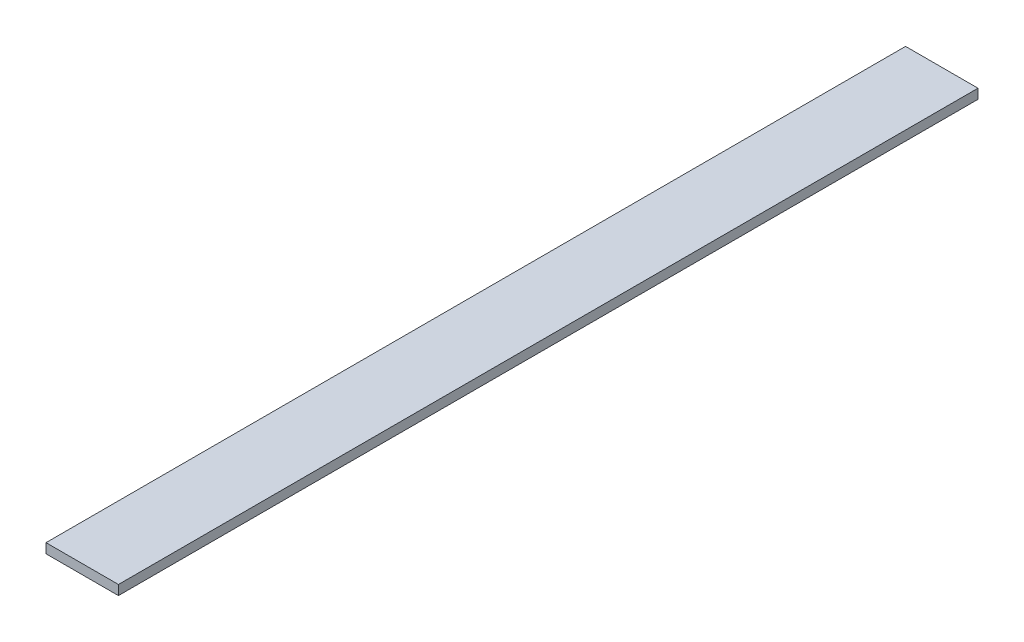
ISO-10303-21;
HEADER;
FILE_DESCRIPTION(('STEP AP214'),'2;1');
FILE_NAME('part.step','',(''),(''),'','','');
FILE_SCHEMA(('AUTOMOTIVE_DESIGN { 1 0 10303 214 1 1 1 1 }'));
ENDSEC;
DATA;
#1=APPLICATION_CONTEXT('core data for automotive mechanical design processes');
#2=APPLICATION_PROTOCOL_DEFINITION('international standard','automotive_design',2000,#1);
#3=PRODUCT_CONTEXT('',#1,'mechanical');
#4=PRODUCT('Part','Part','',(#3));
#5=PRODUCT_RELATED_PRODUCT_CATEGORY('part','',(#4));
#6=PRODUCT_DEFINITION_FORMATION('','',#4);
#7=PRODUCT_DEFINITION_CONTEXT('part definition',#1,'design');
#8=PRODUCT_DEFINITION('design','',#6,#7);
#9=PRODUCT_DEFINITION_SHAPE('','',#8);
#10=(LENGTH_UNIT() NAMED_UNIT(*) SI_UNIT(.MILLI.,.METRE.));
#11=(NAMED_UNIT(*) PLANE_ANGLE_UNIT() SI_UNIT($,.RADIAN.));
#12=(NAMED_UNIT(*) SI_UNIT($,.STERADIAN.) SOLID_ANGLE_UNIT());
#13=UNCERTAINTY_MEASURE_WITH_UNIT(LENGTH_MEASURE(1.E-05),#10,'distance_accuracy_value','');
#14=(GEOMETRIC_REPRESENTATION_CONTEXT(3) GLOBAL_UNCERTAINTY_ASSIGNED_CONTEXT((#13)) GLOBAL_UNIT_ASSIGNED_CONTEXT((#10,
#11,#12)) REPRESENTATION_CONTEXT('',''));
#15=CARTESIAN_POINT('',(0.,0.,0.));
#16=DIRECTION('',(0.,0.,1.));
#17=DIRECTION('',(1.,0.,0.));
#18=AXIS2_PLACEMENT_3D('',#15,#16,#17);
#19=CARTESIAN_POINT('',(7.5,1.,178.));
#20=DIRECTION('',(-1.,0.,0.));
#21=DIRECTION('',(0.,-1.,0.));
#22=AXIS2_PLACEMENT_3D('',#19,#20,#21);
#23=PLANE('',#22);
#24=DIRECTION('',(0.,1.,0.));
#25=VECTOR('',#24,1.);
#26=CARTESIAN_POINT('',(7.5,1.,0.));
#27=LINE('',#26,#25);
#28=CARTESIAN_POINT('',(7.5,-1.,0.));
#29=VERTEX_POINT('',#28);
#30=CARTESIAN_POINT('',(7.5,1.,0.));
#31=VERTEX_POINT('',#30);
#32=EDGE_CURVE('E111',#29,#31,#27,.T.);
#33=ORIENTED_EDGE('',*,*,#32,.T.);
#34=DIRECTION('',(0.,0.,-1.));
#35=VECTOR('',#34,1.);
#36=CARTESIAN_POINT('',(7.5,1.,178.));
#37=LINE('',#36,#35);
#38=CARTESIAN_POINT('',(7.5,1.,178.));
#39=VERTEX_POINT('',#38);
#40=EDGE_CURVE('E11',#39,#31,#37,.T.);
#41=ORIENTED_EDGE('',*,*,#40,.F.);
#42=DIRECTION('',(0.,1.,0.));
#43=VECTOR('',#42,1.);
#44=CARTESIAN_POINT('',(7.5,1.,178.));
#45=LINE('',#44,#43);
#46=CARTESIAN_POINT('',(7.5,-1.,178.));
#47=VERTEX_POINT('',#46);
#48=EDGE_CURVE('E95',#47,#39,#45,.T.);
#49=ORIENTED_EDGE('',*,*,#48,.F.);
#50=DIRECTION('',(0.,0.,-1.));
#51=VECTOR('',#50,1.);
#52=CARTESIAN_POINT('',(7.5,-1.,178.));
#53=LINE('',#52,#51);
#54=EDGE_CURVE('E107',#47,#29,#53,.T.);
#55=ORIENTED_EDGE('',*,*,#54,.T.);
#56=EDGE_LOOP('',(#33,#41,#49,#55));
#57=FACE_BOUND('',#56,.T.);
#58=ADVANCED_FACE('F43',(#57),#23,.F.);
#59=CARTESIAN_POINT('',(-7.5,1.,178.));
#60=DIRECTION('',(0.,-1.,0.));
#61=DIRECTION('',(0.,0.,-1.));
#62=AXIS2_PLACEMENT_3D('',#59,#60,#61);
#63=PLANE('',#62);
#64=DIRECTION('',(-1.,0.,0.));
#65=VECTOR('',#64,1.);
#66=CARTESIAN_POINT('',(-7.5,1.,0.));
#67=LINE('',#66,#65);
#68=CARTESIAN_POINT('',(-7.5,1.,0.));
#69=VERTEX_POINT('',#68);
#70=EDGE_CURVE('E100',#31,#69,#67,.T.);
#71=ORIENTED_EDGE('',*,*,#70,.T.);
#72=DIRECTION('',(0.,0.,-1.));
#73=VECTOR('',#72,1.);
#74=CARTESIAN_POINT('',(-7.5,1.,178.));
#75=LINE('',#74,#73);
#76=CARTESIAN_POINT('',(-7.5,1.,178.));
#77=VERTEX_POINT('',#76);
#78=EDGE_CURVE('E52',#77,#69,#75,.T.);
#79=ORIENTED_EDGE('',*,*,#78,.F.);
#80=DIRECTION('',(-1.,0.,0.));
#81=VECTOR('',#80,1.);
#82=CARTESIAN_POINT('',(-7.5,1.,178.));
#83=LINE('',#82,#81);
#84=EDGE_CURVE('E90',#39,#77,#83,.T.);
#85=ORIENTED_EDGE('',*,*,#84,.F.);
#86=ORIENTED_EDGE('',*,*,#40,.T.);
#87=EDGE_LOOP('',(#71,#79,#85,#86));
#88=FACE_BOUND('',#87,.T.);
#89=ADVANCED_FACE('F99',(#88),#63,.F.);
#90=CARTESIAN_POINT('',(-7.5,1.,178.));
#91=DIRECTION('',(1.,0.,0.));
#92=DIRECTION('',(0.,0.,-1.));
#93=AXIS2_PLACEMENT_3D('',#90,#91,#92);
#94=PLANE('',#93);
#95=DIRECTION('',(0.,-1.,0.));
#96=VECTOR('',#95,1.);
#97=CARTESIAN_POINT('',(-7.5,1.,0.));
#98=LINE('',#97,#96);
#99=CARTESIAN_POINT('',(-7.5,-1.,0.));
#100=VERTEX_POINT('',#99);
#101=EDGE_CURVE('E77',#69,#100,#98,.T.);
#102=ORIENTED_EDGE('',*,*,#101,.T.);
#103=DIRECTION('',(0.,0.,-1.));
#104=VECTOR('',#103,1.);
#105=CARTESIAN_POINT('',(-7.5,-1.,178.));
#106=LINE('',#105,#104);
#107=CARTESIAN_POINT('',(-7.5,-1.,178.));
#108=VERTEX_POINT('',#107);
#109=EDGE_CURVE('E102',#108,#100,#106,.T.);
#110=ORIENTED_EDGE('',*,*,#109,.F.);
#111=DIRECTION('',(0.,-1.,0.));
#112=VECTOR('',#111,1.);
#113=CARTESIAN_POINT('',(-7.5,1.,178.));
#114=LINE('',#113,#112);
#115=EDGE_CURVE('E93',#77,#108,#114,.T.);
#116=ORIENTED_EDGE('',*,*,#115,.F.);
#117=ORIENTED_EDGE('',*,*,#78,.T.);
#118=EDGE_LOOP('',(#102,#110,#116,#117));
#119=FACE_BOUND('',#118,.T.);
#120=ADVANCED_FACE('F103',(#119),#94,.F.);
#121=CARTESIAN_POINT('',(-7.5,-1.,178.));
#122=DIRECTION('',(0.,1.,0.));
#123=DIRECTION('',(0.,0.,1.));
#124=AXIS2_PLACEMENT_3D('',#121,#122,#123);
#125=PLANE('',#124);
#126=DIRECTION('',(1.,0.,0.));
#127=VECTOR('',#126,1.);
#128=CARTESIAN_POINT('',(-7.5,-1.,0.));
#129=LINE('',#128,#127);
#130=EDGE_CURVE('E83',#100,#29,#129,.T.);
#131=ORIENTED_EDGE('',*,*,#130,.T.);
#132=ORIENTED_EDGE('',*,*,#54,.F.);
#133=DIRECTION('',(1.,0.,0.));
#134=VECTOR('',#133,1.);
#135=CARTESIAN_POINT('',(-7.5,-1.,178.));
#136=LINE('',#135,#134);
#137=EDGE_CURVE('E60',#108,#47,#136,.T.);
#138=ORIENTED_EDGE('',*,*,#137,.F.);
#139=ORIENTED_EDGE('',*,*,#109,.T.);
#140=EDGE_LOOP('',(#131,#132,#138,#139));
#141=FACE_BOUND('',#140,.T.);
#142=ADVANCED_FACE('F124',(#141),#125,.F.);
#143=CARTESIAN_POINT('',(0.,0.,178.));
#144=DIRECTION('',(0.,0.,1.));
#145=DIRECTION('',(1.,0.,0.));
#146=AXIS2_PLACEMENT_3D('',#143,#144,#145);
#147=PLANE('',#146);
#148=ORIENTED_EDGE('',*,*,#48,.T.);
#149=ORIENTED_EDGE('',*,*,#84,.T.);
#150=ORIENTED_EDGE('',*,*,#115,.T.);
#151=ORIENTED_EDGE('',*,*,#137,.T.);
#152=EDGE_LOOP('',(#148,#149,#150,#151));
#153=FACE_BOUND('',#152,.T.);
#154=ADVANCED_FACE('F91',(#153),#147,.T.);
#155=CARTESIAN_POINT('',(0.,0.,0.));
#156=DIRECTION('',(0.,0.,1.));
#157=DIRECTION('',(1.,0.,0.));
#158=AXIS2_PLACEMENT_3D('',#155,#156,#157);
#159=PLANE('',#158);
#160=ORIENTED_EDGE('',*,*,#32,.F.);
#161=ORIENTED_EDGE('',*,*,#130,.F.);
#162=ORIENTED_EDGE('',*,*,#101,.F.);
#163=ORIENTED_EDGE('',*,*,#70,.F.);
#164=EDGE_LOOP('',(#160,#161,#162,#163));
#165=FACE_BOUND('',#164,.T.);
#166=ADVANCED_FACE('F127',(#165),#159,.F.);
#167=CLOSED_SHELL('',(#58,#89,#120,#142,#154,#166));
#168=MANIFOLD_SOLID_BREP('B2',#167);
#169=ADVANCED_BREP_SHAPE_REPRESENTATION('',(#18,#168),#14);
#170=SHAPE_DEFINITION_REPRESENTATION(#9,#169);
ENDSEC;
END-ISO-10303-21;
